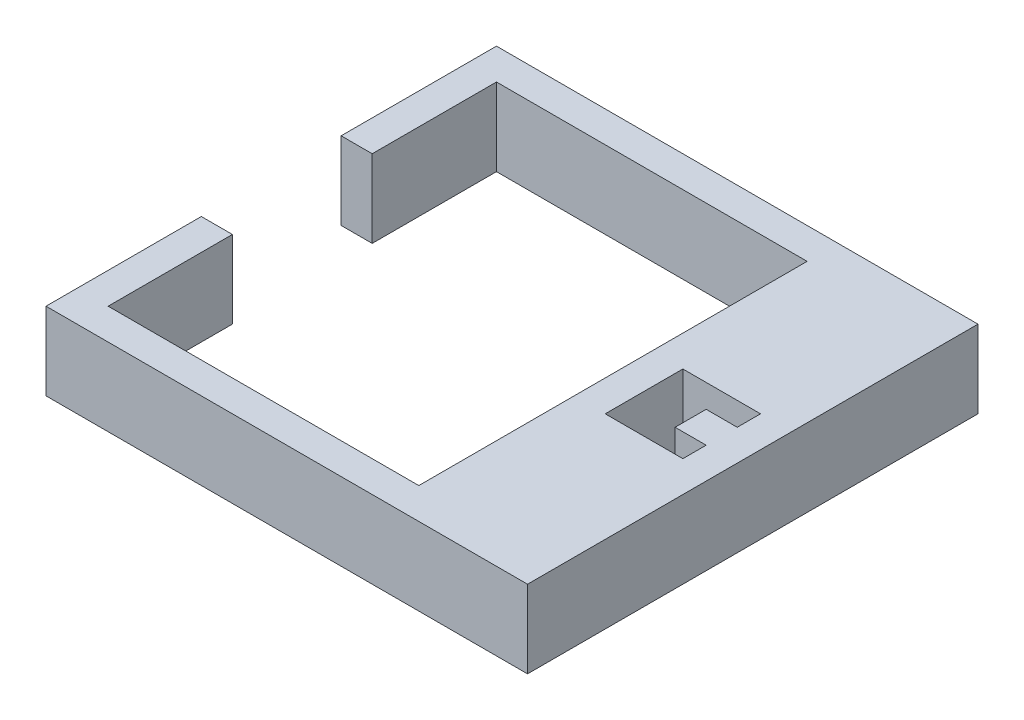
ISO-10303-21;
HEADER;
FILE_DESCRIPTION(('STEP AP214'),'2;1');
FILE_NAME('part.step','',(''),(''),'','','');
FILE_SCHEMA(('AUTOMOTIVE_DESIGN { 1 0 10303 214 1 1 1 1 }'));
ENDSEC;
DATA;
#1=APPLICATION_CONTEXT('core data for automotive mechanical design processes');
#2=APPLICATION_PROTOCOL_DEFINITION('international standard','automotive_design',2000,#1);
#3=PRODUCT_CONTEXT('',#1,'mechanical');
#4=PRODUCT('Part','Part','',(#3));
#5=PRODUCT_RELATED_PRODUCT_CATEGORY('part','',(#4));
#6=PRODUCT_DEFINITION_FORMATION('','',#4);
#7=PRODUCT_DEFINITION_CONTEXT('part definition',#1,'design');
#8=PRODUCT_DEFINITION('design','',#6,#7);
#9=PRODUCT_DEFINITION_SHAPE('','',#8);
#10=(LENGTH_UNIT() NAMED_UNIT(*) SI_UNIT(.MILLI.,.METRE.));
#11=(NAMED_UNIT(*) PLANE_ANGLE_UNIT() SI_UNIT($,.RADIAN.));
#12=(NAMED_UNIT(*) SI_UNIT($,.STERADIAN.) SOLID_ANGLE_UNIT());
#13=UNCERTAINTY_MEASURE_WITH_UNIT(LENGTH_MEASURE(1.E-05),#10,'distance_accuracy_value','');
#14=(GEOMETRIC_REPRESENTATION_CONTEXT(3) GLOBAL_UNCERTAINTY_ASSIGNED_CONTEXT((#13)) GLOBAL_UNIT_ASSIGNED_CONTEXT((#10,
#11,#12)) REPRESENTATION_CONTEXT('',''));
#15=CARTESIAN_POINT('',(0.,0.,0.));
#16=DIRECTION('',(0.,0.,1.));
#17=DIRECTION('',(1.,0.,0.));
#18=AXIS2_PLACEMENT_3D('',#15,#16,#17);
#19=CARTESIAN_POINT('',(6.06232294617563,50.,0.));
#20=DIRECTION('',(1.,0.,0.));
#21=DIRECTION('',(0.,0.,-1.));
#22=AXIS2_PLACEMENT_3D('',#19,#20,#21);
#23=PLANE('',#22);
#24=DIRECTION('',(0.,0.,1.));
#25=VECTOR('',#24,1.);
#26=CARTESIAN_POINT('',(6.06232294617563,0.,0.));
#27=LINE('',#26,#25);
#28=CARTESIAN_POINT('',(6.06232294617563,0.,-6.38810198300284));
#29=VERTEX_POINT('',#28);
#30=CARTESIAN_POINT('',(6.06232294617563,0.,13.6118980169972));
#31=VERTEX_POINT('',#30);
#32=EDGE_CURVE('E122',#29,#31,#27,.T.);
#33=ORIENTED_EDGE('',*,*,#32,.T.);
#34=DIRECTION('',(0.,-1.,0.));
#35=VECTOR('',#34,1.);
#36=CARTESIAN_POINT('',(6.06232294617563,50.,13.6118980169972));
#37=LINE('',#36,#35);
#38=CARTESIAN_POINT('',(6.06232294617563,50.,13.6118980169972));
#39=VERTEX_POINT('',#38);
#40=EDGE_CURVE('E89',#39,#31,#37,.T.);
#41=ORIENTED_EDGE('',*,*,#40,.F.);
#42=DIRECTION('',(0.,0.,1.));
#43=VECTOR('',#42,1.);
#44=CARTESIAN_POINT('',(6.06232294617563,50.,0.));
#45=LINE('',#44,#43);
#46=CARTESIAN_POINT('',(6.06232294617563,50.,-6.38810198300284));
#47=VERTEX_POINT('',#46);
#48=EDGE_CURVE('E113',#47,#39,#45,.T.);
#49=ORIENTED_EDGE('',*,*,#48,.F.);
#50=DIRECTION('',(0.,-1.,0.));
#51=VECTOR('',#50,1.);
#52=CARTESIAN_POINT('',(6.06232294617563,50.,-6.38810198300284));
#53=LINE('',#52,#51);
#54=EDGE_CURVE('E126',#47,#29,#53,.T.);
#55=ORIENTED_EDGE('',*,*,#54,.T.);
#56=EDGE_LOOP('',(#33,#41,#49,#55));
#57=FACE_BOUND('',#56,.T.);
#58=ADVANCED_FACE('F85',(#57),#23,.F.);
#59=CARTESIAN_POINT('',(0.,50.,-6.38810198300284));
#60=DIRECTION('',(0.,0.,1.));
#61=DIRECTION('',(1.,0.,0.));
#62=AXIS2_PLACEMENT_3D('',#59,#60,#61);
#63=PLANE('',#62);
#64=DIRECTION('',(-1.,0.,0.));
#65=VECTOR('',#64,1.);
#66=CARTESIAN_POINT('',(0.,0.,-6.38810198300284));
#67=LINE('',#66,#65);
#68=CARTESIAN_POINT('',(26.0623229461756,0.,-6.38810198300284));
#69=VERTEX_POINT('',#68);
#70=EDGE_CURVE('E131',#69,#29,#67,.T.);
#71=ORIENTED_EDGE('',*,*,#70,.T.);
#72=ORIENTED_EDGE('',*,*,#54,.F.);
#73=DIRECTION('',(-1.,0.,0.));
#74=VECTOR('',#73,1.);
#75=CARTESIAN_POINT('',(0.,50.,-6.38810198300284));
#76=LINE('',#75,#74);
#77=CARTESIAN_POINT('',(26.0623229461756,50.,-6.38810198300284));
#78=VERTEX_POINT('',#77);
#79=EDGE_CURVE('E283',#78,#47,#76,.T.);
#80=ORIENTED_EDGE('',*,*,#79,.F.);
#81=DIRECTION('',(0.,-1.,0.));
#82=VECTOR('',#81,1.);
#83=CARTESIAN_POINT('',(26.0623229461756,50.,-6.38810198300284));
#84=LINE('',#83,#82);
#85=EDGE_CURVE('E152',#78,#69,#84,.T.);
#86=ORIENTED_EDGE('',*,*,#85,.T.);
#87=EDGE_LOOP('',(#71,#72,#80,#86));
#88=FACE_BOUND('',#87,.T.);
#89=ADVANCED_FACE('F451',(#88),#63,.F.);
#90=CARTESIAN_POINT('',(0.,50.,-121.388101983003));
#91=DIRECTION('',(0.,0.,-1.));
#92=DIRECTION('',(-1.,0.,0.));
#93=AXIS2_PLACEMENT_3D('',#90,#91,#92);
#94=PLANE('',#93);
#95=DIRECTION('',(1.,0.,0.));
#96=VECTOR('',#95,1.);
#97=CARTESIAN_POINT('',(0.,0.,-121.388101983003));
#98=LINE('',#97,#96);
#99=CARTESIAN_POINT('',(-243.937677053824,0.,-121.388101983003));
#100=VERTEX_POINT('',#99);
#101=CARTESIAN_POINT('',(-43.9376770538244,0.,-121.388101983003));
#102=VERTEX_POINT('',#101);
#103=EDGE_CURVE('E225',#100,#102,#98,.T.);
#104=ORIENTED_EDGE('',*,*,#103,.T.);
#105=DIRECTION('',(0.,-1.,0.));
#106=VECTOR('',#105,1.);
#107=CARTESIAN_POINT('',(-43.9376770538244,50.,-121.388101983003));
#108=LINE('',#107,#106);
#109=CARTESIAN_POINT('',(-43.9376770538244,50.,-121.388101983003));
#110=VERTEX_POINT('',#109);
#111=EDGE_CURVE('E162',#110,#102,#108,.T.);
#112=ORIENTED_EDGE('',*,*,#111,.F.);
#113=DIRECTION('',(1.,0.,0.));
#114=VECTOR('',#113,1.);
#115=CARTESIAN_POINT('',(0.,50.,-121.388101983003));
#116=LINE('',#115,#114);
#117=CARTESIAN_POINT('',(-243.937677053824,50.,-121.388101983003));
#118=VERTEX_POINT('',#117);
#119=EDGE_CURVE('E273',#118,#110,#116,.T.);
#120=ORIENTED_EDGE('',*,*,#119,.F.);
#121=DIRECTION('',(0.,-1.,0.));
#122=VECTOR('',#121,1.);
#123=CARTESIAN_POINT('',(-243.937677053824,50.,-121.388101983003));
#124=LINE('',#123,#122);
#125=EDGE_CURVE('E95',#118,#100,#124,.T.);
#126=ORIENTED_EDGE('',*,*,#125,.T.);
#127=EDGE_LOOP('',(#104,#112,#120,#126));
#128=FACE_BOUND('',#127,.T.);
#129=ADVANCED_FACE('F405',(#128),#94,.F.);
#130=CARTESIAN_POINT('',(-43.9376770538244,50.,0.));
#131=DIRECTION('',(1.,0.,0.));
#132=DIRECTION('',(0.,0.,-1.));
#133=AXIS2_PLACEMENT_3D('',#130,#131,#132);
#134=PLANE('',#133);
#135=DIRECTION('',(0.,0.,1.));
#136=VECTOR('',#135,1.);
#137=CARTESIAN_POINT('',(-43.9376770538244,0.,0.));
#138=LINE('',#137,#136);
#139=CARTESIAN_POINT('',(-43.9376770538244,0.,128.611898016997));
#140=VERTEX_POINT('',#139);
#141=EDGE_CURVE('E222',#102,#140,#138,.T.);
#142=ORIENTED_EDGE('',*,*,#141,.T.);
#143=DIRECTION('',(0.,-1.,0.));
#144=VECTOR('',#143,1.);
#145=CARTESIAN_POINT('',(-43.9376770538244,50.,128.611898016997));
#146=LINE('',#145,#144);
#147=CARTESIAN_POINT('',(-43.9376770538244,50.,128.611898016997));
#148=VERTEX_POINT('',#147);
#149=EDGE_CURVE('E165',#148,#140,#146,.T.);
#150=ORIENTED_EDGE('',*,*,#149,.F.);
#151=DIRECTION('',(0.,0.,1.));
#152=VECTOR('',#151,1.);
#153=CARTESIAN_POINT('',(-43.9376770538244,50.,0.));
#154=LINE('',#153,#152);
#155=EDGE_CURVE('E270',#110,#148,#154,.T.);
#156=ORIENTED_EDGE('',*,*,#155,.F.);
#157=ORIENTED_EDGE('',*,*,#111,.T.);
#158=EDGE_LOOP('',(#142,#150,#156,#157));
#159=FACE_BOUND('',#158,.T.);
#160=ADVANCED_FACE('F440',(#159),#134,.F.);
#161=CARTESIAN_POINT('',(0.,50.,128.611898016997));
#162=DIRECTION('',(0.,0.,-1.));
#163=DIRECTION('',(-1.,0.,0.));
#164=AXIS2_PLACEMENT_3D('',#161,#162,#163);
#165=PLANE('',#164);
#166=DIRECTION('',(1.,0.,0.));
#167=VECTOR('',#166,1.);
#168=CARTESIAN_POINT('',(0.,0.,128.611898016997));
#169=LINE('',#168,#167);
#170=CARTESIAN_POINT('',(-243.937677053824,0.,128.611898016997));
#171=VERTEX_POINT('',#170);
#172=EDGE_CURVE('E219',#171,#140,#169,.T.);
#173=ORIENTED_EDGE('',*,*,#172,.F.);
#174=DIRECTION('',(0.,-1.,0.));
#175=VECTOR('',#174,1.);
#176=CARTESIAN_POINT('',(-243.937677053824,50.,128.611898016997));
#177=LINE('',#176,#175);
#178=CARTESIAN_POINT('',(-243.937677053824,50.,128.611898016997));
#179=VERTEX_POINT('',#178);
#180=EDGE_CURVE('E168',#179,#171,#177,.T.);
#181=ORIENTED_EDGE('',*,*,#180,.F.);
#182=DIRECTION('',(1.,0.,0.));
#183=VECTOR('',#182,1.);
#184=CARTESIAN_POINT('',(0.,50.,128.611898016997));
#185=LINE('',#184,#183);
#186=EDGE_CURVE('E267',#179,#148,#185,.T.);
#187=ORIENTED_EDGE('',*,*,#186,.T.);
#188=ORIENTED_EDGE('',*,*,#149,.T.);
#189=EDGE_LOOP('',(#173,#181,#187,#188));
#190=FACE_BOUND('',#189,.T.);
#191=ADVANCED_FACE('F435',(#190),#165,.T.);
#192=CARTESIAN_POINT('',(-243.937677053824,50.,0.));
#193=DIRECTION('',(-1.,0.,0.));
#194=DIRECTION('',(0.,0.,1.));
#195=AXIS2_PLACEMENT_3D('',#192,#193,#194);
#196=PLANE('',#195);
#197=DIRECTION('',(0.,0.,-1.));
#198=VECTOR('',#197,1.);
#199=CARTESIAN_POINT('',(-243.937677053824,0.,0.));
#200=LINE('',#199,#198);
#201=CARTESIAN_POINT('',(-243.937677053824,0.,48.6118980169971));
#202=VERTEX_POINT('',#201);
#203=EDGE_CURVE('E216',#171,#202,#200,.T.);
#204=ORIENTED_EDGE('',*,*,#203,.T.);
#205=DIRECTION('',(0.,-1.,0.));
#206=VECTOR('',#205,1.);
#207=CARTESIAN_POINT('',(-243.937677053824,50.,48.6118980169971));
#208=LINE('',#207,#206);
#209=CARTESIAN_POINT('',(-243.937677053824,50.,48.6118980169971));
#210=VERTEX_POINT('',#209);
#211=EDGE_CURVE('E171',#210,#202,#208,.T.);
#212=ORIENTED_EDGE('',*,*,#211,.F.);
#213=DIRECTION('',(0.,0.,-1.));
#214=VECTOR('',#213,1.);
#215=CARTESIAN_POINT('',(-243.937677053824,50.,0.));
#216=LINE('',#215,#214);
#217=EDGE_CURVE('E264',#179,#210,#216,.T.);
#218=ORIENTED_EDGE('',*,*,#217,.F.);
#219=ORIENTED_EDGE('',*,*,#180,.T.);
#220=EDGE_LOOP('',(#204,#212,#218,#219));
#221=FACE_BOUND('',#220,.T.);
#222=ADVANCED_FACE('F441',(#221),#196,.F.);
#223=CARTESIAN_POINT('',(0.,50.,48.6118980169971));
#224=DIRECTION('',(0.,0.,-1.));
#225=DIRECTION('',(-1.,0.,0.));
#226=AXIS2_PLACEMENT_3D('',#223,#224,#225);
#227=PLANE('',#226);
#228=DIRECTION('',(1.,0.,0.));
#229=VECTOR('',#228,1.);
#230=CARTESIAN_POINT('',(0.,0.,48.6118980169971));
#231=LINE('',#230,#229);
#232=CARTESIAN_POINT('',(-263.937677053824,0.,48.6118980169971));
#233=VERTEX_POINT('',#232);
#234=EDGE_CURVE('E213',#233,#202,#231,.T.);
#235=ORIENTED_EDGE('',*,*,#234,.F.);
#236=DIRECTION('',(0.,-1.,0.));
#237=VECTOR('',#236,1.);
#238=CARTESIAN_POINT('',(-263.937677053824,50.,48.6118980169971));
#239=LINE('',#238,#237);
#240=CARTESIAN_POINT('',(-263.937677053824,50.,48.6118980169971));
#241=VERTEX_POINT('',#240);
#242=EDGE_CURVE('E174',#241,#233,#239,.T.);
#243=ORIENTED_EDGE('',*,*,#242,.F.);
#244=DIRECTION('',(1.,0.,0.));
#245=VECTOR('',#244,1.);
#246=CARTESIAN_POINT('',(0.,50.,48.6118980169971));
#247=LINE('',#246,#245);
#248=EDGE_CURVE('E261',#241,#210,#247,.T.);
#249=ORIENTED_EDGE('',*,*,#248,.T.);
#250=ORIENTED_EDGE('',*,*,#211,.T.);
#251=EDGE_LOOP('',(#235,#243,#249,#250));
#252=FACE_BOUND('',#251,.T.);
#253=ADVANCED_FACE('F429',(#252),#227,.T.);
#254=CARTESIAN_POINT('',(-263.937677053824,50.,0.));
#255=DIRECTION('',(-1.,0.,0.));
#256=DIRECTION('',(0.,0.,1.));
#257=AXIS2_PLACEMENT_3D('',#254,#255,#256);
#258=PLANE('',#257);
#259=DIRECTION('',(0.,0.,-1.));
#260=VECTOR('',#259,1.);
#261=CARTESIAN_POINT('',(-263.937677053824,0.,0.));
#262=LINE('',#261,#260);
#263=CARTESIAN_POINT('',(-263.937677053824,0.,148.611898016997));
#264=VERTEX_POINT('',#263);
#265=EDGE_CURVE('E210',#264,#233,#262,.T.);
#266=ORIENTED_EDGE('',*,*,#265,.F.);
#267=DIRECTION('',(0.,-1.,0.));
#268=VECTOR('',#267,1.);
#269=CARTESIAN_POINT('',(-263.937677053824,50.,148.611898016997));
#270=LINE('',#269,#268);
#271=CARTESIAN_POINT('',(-263.937677053824,50.,148.611898016997));
#272=VERTEX_POINT('',#271);
#273=EDGE_CURVE('E177',#272,#264,#270,.T.);
#274=ORIENTED_EDGE('',*,*,#273,.F.);
#275=DIRECTION('',(0.,0.,-1.));
#276=VECTOR('',#275,1.);
#277=CARTESIAN_POINT('',(-263.937677053824,50.,0.));
#278=LINE('',#277,#276);
#279=EDGE_CURVE('E258',#272,#241,#278,.T.);
#280=ORIENTED_EDGE('',*,*,#279,.T.);
#281=ORIENTED_EDGE('',*,*,#242,.T.);
#282=EDGE_LOOP('',(#266,#274,#280,#281));
#283=FACE_BOUND('',#282,.T.);
#284=ADVANCED_FACE('F423',(#283),#258,.T.);
#285=CARTESIAN_POINT('',(0.,50.,148.611898016997));
#286=DIRECTION('',(0.,0.,-1.));
#287=DIRECTION('',(-1.,0.,0.));
#288=AXIS2_PLACEMENT_3D('',#285,#286,#287);
#289=PLANE('',#288);
#290=DIRECTION('',(1.,0.,0.));
#291=VECTOR('',#290,1.);
#292=CARTESIAN_POINT('',(0.,0.,148.611898016997));
#293=LINE('',#292,#291);
#294=CARTESIAN_POINT('',(46.0623229461755,0.,148.611898016997));
#295=VERTEX_POINT('',#294);
#296=EDGE_CURVE('E207',#264,#295,#293,.T.);
#297=ORIENTED_EDGE('',*,*,#296,.T.);
#298=DIRECTION('',(0.,-1.,0.));
#299=VECTOR('',#298,1.);
#300=CARTESIAN_POINT('',(46.0623229461755,50.,148.611898016997));
#301=LINE('',#300,#299);
#302=CARTESIAN_POINT('',(46.0623229461755,50.,148.611898016997));
#303=VERTEX_POINT('',#302);
#304=EDGE_CURVE('E180',#303,#295,#301,.T.);
#305=ORIENTED_EDGE('',*,*,#304,.F.);
#306=DIRECTION('',(1.,0.,0.));
#307=VECTOR('',#306,1.);
#308=CARTESIAN_POINT('',(0.,50.,148.611898016997));
#309=LINE('',#308,#307);
#310=EDGE_CURVE('E255',#272,#303,#309,.T.);
#311=ORIENTED_EDGE('',*,*,#310,.F.);
#312=ORIENTED_EDGE('',*,*,#273,.T.);
#313=EDGE_LOOP('',(#297,#305,#311,#312));
#314=FACE_BOUND('',#313,.T.);
#315=ADVANCED_FACE('F596',(#314),#289,.F.);
#316=CARTESIAN_POINT('',(46.0623229461756,50.,0.));
#317=DIRECTION('',(1.,0.,0.));
#318=DIRECTION('',(0.,0.,-1.));
#319=AXIS2_PLACEMENT_3D('',#316,#317,#318);
#320=PLANE('',#319);
#321=DIRECTION('',(0.,0.,1.));
#322=VECTOR('',#321,1.);
#323=CARTESIAN_POINT('',(46.0623229461756,0.,0.));
#324=LINE('',#323,#322);
#325=CARTESIAN_POINT('',(46.0623229461756,0.,-141.388101983003));
#326=VERTEX_POINT('',#325);
#327=EDGE_CURVE('E204',#326,#295,#324,.T.);
#328=ORIENTED_EDGE('',*,*,#327,.F.);
#329=DIRECTION('',(0.,-1.,0.));
#330=VECTOR('',#329,1.);
#331=CARTESIAN_POINT('',(46.0623229461756,50.,-141.388101983003));
#332=LINE('',#331,#330);
#333=CARTESIAN_POINT('',(46.0623229461756,50.,-141.388101983003));
#334=VERTEX_POINT('',#333);
#335=EDGE_CURVE('E183',#334,#326,#332,.T.);
#336=ORIENTED_EDGE('',*,*,#335,.F.);
#337=DIRECTION('',(0.,0.,1.));
#338=VECTOR('',#337,1.);
#339=CARTESIAN_POINT('',(46.0623229461756,50.,0.));
#340=LINE('',#339,#338);
#341=EDGE_CURVE('E252',#334,#303,#340,.T.);
#342=ORIENTED_EDGE('',*,*,#341,.T.);
#343=ORIENTED_EDGE('',*,*,#304,.T.);
#344=EDGE_LOOP('',(#328,#336,#342,#343));
#345=FACE_BOUND('',#344,.T.);
#346=ADVANCED_FACE('F417',(#345),#320,.T.);
#347=CARTESIAN_POINT('',(0.,50.,-141.388101983003));
#348=DIRECTION('',(0.,0.,-1.));
#349=DIRECTION('',(-1.,0.,0.));
#350=AXIS2_PLACEMENT_3D('',#347,#348,#349);
#351=PLANE('',#350);
#352=DIRECTION('',(1.,0.,0.));
#353=VECTOR('',#352,1.);
#354=CARTESIAN_POINT('',(0.,0.,-141.388101983003));
#355=LINE('',#354,#353);
#356=CARTESIAN_POINT('',(-263.937677053824,0.,-141.388101983003));
#357=VERTEX_POINT('',#356);
#358=EDGE_CURVE('E201',#357,#326,#355,.T.);
#359=ORIENTED_EDGE('',*,*,#358,.F.);
#360=DIRECTION('',(0.,-1.,0.));
#361=VECTOR('',#360,1.);
#362=CARTESIAN_POINT('',(-263.937677053824,50.,-141.388101983003));
#363=LINE('',#362,#361);
#364=CARTESIAN_POINT('',(-263.937677053824,50.,-141.388101983003));
#365=VERTEX_POINT('',#364);
#366=EDGE_CURVE('E186',#365,#357,#363,.T.);
#367=ORIENTED_EDGE('',*,*,#366,.F.);
#368=DIRECTION('',(1.,0.,0.));
#369=VECTOR('',#368,1.);
#370=CARTESIAN_POINT('',(0.,50.,-141.388101983003));
#371=LINE('',#370,#369);
#372=EDGE_CURVE('E249',#365,#334,#371,.T.);
#373=ORIENTED_EDGE('',*,*,#372,.T.);
#374=ORIENTED_EDGE('',*,*,#335,.T.);
#375=EDGE_LOOP('',(#359,#367,#373,#374));
#376=FACE_BOUND('',#375,.T.);
#377=ADVANCED_FACE('F414',(#376),#351,.T.);
#378=CARTESIAN_POINT('',(-263.937677053824,50.,0.));
#379=DIRECTION('',(1.,0.,0.));
#380=DIRECTION('',(0.,0.,-1.));
#381=AXIS2_PLACEMENT_3D('',#378,#379,#380);
#382=PLANE('',#381);
#383=DIRECTION('',(0.,0.,1.));
#384=VECTOR('',#383,1.);
#385=CARTESIAN_POINT('',(-263.937677053824,0.,0.));
#386=LINE('',#385,#384);
#387=CARTESIAN_POINT('',(-263.937677053824,0.,-41.3881019830028));
#388=VERTEX_POINT('',#387);
#389=EDGE_CURVE('E198',#357,#388,#386,.T.);
#390=ORIENTED_EDGE('',*,*,#389,.T.);
#391=DIRECTION('',(0.,-1.,0.));
#392=VECTOR('',#391,1.);
#393=CARTESIAN_POINT('',(-263.937677053824,50.,-41.3881019830028));
#394=LINE('',#393,#392);
#395=CARTESIAN_POINT('',(-263.937677053824,50.,-41.3881019830028));
#396=VERTEX_POINT('',#395);
#397=EDGE_CURVE('E189',#396,#388,#394,.T.);
#398=ORIENTED_EDGE('',*,*,#397,.F.);
#399=DIRECTION('',(0.,0.,1.));
#400=VECTOR('',#399,1.);
#401=CARTESIAN_POINT('',(-263.937677053824,50.,0.));
#402=LINE('',#401,#400);
#403=EDGE_CURVE('E246',#365,#396,#402,.T.);
#404=ORIENTED_EDGE('',*,*,#403,.F.);
#405=ORIENTED_EDGE('',*,*,#366,.T.);
#406=EDGE_LOOP('',(#390,#398,#404,#405));
#407=FACE_BOUND('',#406,.T.);
#408=ADVANCED_FACE('F411',(#407),#382,.F.);
#409=CARTESIAN_POINT('',(0.,50.,-41.3881019830028));
#410=DIRECTION('',(0.,0.,-1.));
#411=DIRECTION('',(-1.,0.,0.));
#412=AXIS2_PLACEMENT_3D('',#409,#410,#411);
#413=PLANE('',#412);
#414=DIRECTION('',(1.,0.,0.));
#415=VECTOR('',#414,1.);
#416=CARTESIAN_POINT('',(0.,0.,-41.3881019830028));
#417=LINE('',#416,#415);
#418=CARTESIAN_POINT('',(-243.937677053824,0.,-41.3881019830028));
#419=VERTEX_POINT('',#418);
#420=EDGE_CURVE('E194',#388,#419,#417,.T.);
#421=ORIENTED_EDGE('',*,*,#420,.T.);
#422=DIRECTION('',(0.,-1.,0.));
#423=VECTOR('',#422,1.);
#424=CARTESIAN_POINT('',(-243.937677053824,50.,-41.3881019830028));
#425=LINE('',#424,#423);
#426=CARTESIAN_POINT('',(-243.937677053824,50.,-41.3881019830028));
#427=VERTEX_POINT('',#426);
#428=EDGE_CURVE('E145',#427,#419,#425,.T.);
#429=ORIENTED_EDGE('',*,*,#428,.F.);
#430=DIRECTION('',(1.,0.,0.));
#431=VECTOR('',#430,1.);
#432=CARTESIAN_POINT('',(0.,50.,-41.3881019830028));
#433=LINE('',#432,#431);
#434=EDGE_CURVE('E159',#396,#427,#433,.T.);
#435=ORIENTED_EDGE('',*,*,#434,.F.);
#436=ORIENTED_EDGE('',*,*,#397,.T.);
#437=EDGE_LOOP('',(#421,#429,#435,#436));
#438=FACE_BOUND('',#437,.T.);
#439=ADVANCED_FACE('F399',(#438),#413,.F.);
#440=CARTESIAN_POINT('',(-243.937677053824,50.,0.));
#441=DIRECTION('',(1.,0.,0.));
#442=DIRECTION('',(0.,0.,-1.));
#443=AXIS2_PLACEMENT_3D('',#440,#441,#442);
#444=PLANE('',#443);
#445=DIRECTION('',(0.,0.,1.));
#446=VECTOR('',#445,1.);
#447=CARTESIAN_POINT('',(-243.937677053824,0.,0.));
#448=LINE('',#447,#446);
#449=EDGE_CURVE('E228',#100,#419,#448,.T.);
#450=ORIENTED_EDGE('',*,*,#449,.F.);
#451=ORIENTED_EDGE('',*,*,#125,.F.);
#452=DIRECTION('',(0.,0.,1.));
#453=VECTOR('',#452,1.);
#454=CARTESIAN_POINT('',(-243.937677053824,50.,0.));
#455=LINE('',#454,#453);
#456=EDGE_CURVE('E276',#118,#427,#455,.T.);
#457=ORIENTED_EDGE('',*,*,#456,.T.);
#458=ORIENTED_EDGE('',*,*,#428,.T.);
#459=EDGE_LOOP('',(#450,#451,#457,#458));
#460=FACE_BOUND('',#459,.T.);
#461=ADVANCED_FACE('F396',(#460),#444,.T.);
#462=CARTESIAN_POINT('',(26.0623229461756,50.,0.));
#463=DIRECTION('',(1.,0.,0.));
#464=DIRECTION('',(0.,0.,-1.));
#465=AXIS2_PLACEMENT_3D('',#462,#463,#464);
#466=PLANE('',#465);
#467=DIRECTION('',(0.,0.,1.));
#468=VECTOR('',#467,1.);
#469=CARTESIAN_POINT('',(26.0623229461756,50.,0.));
#470=LINE('',#469,#468);
#471=CARTESIAN_POINT('',(26.0623229461756,50.,13.6118980169972));
#472=VERTEX_POINT('',#471);
#473=CARTESIAN_POINT('',(26.0623229461756,50.,28.6118980169972));
#474=VERTEX_POINT('',#473);
#475=EDGE_CURVE('E279',#472,#474,#470,.T.);
#476=ORIENTED_EDGE('',*,*,#475,.F.);
#477=DIRECTION('',(0.,-1.,0.));
#478=VECTOR('',#477,1.);
#479=CARTESIAN_POINT('',(26.0623229461756,50.,13.6118980169972));
#480=LINE('',#479,#478);
#481=CARTESIAN_POINT('',(26.0623229461756,0.,13.6118980169972));
#482=VERTEX_POINT('',#481);
#483=EDGE_CURVE('E12',#472,#482,#480,.T.);
#484=ORIENTED_EDGE('',*,*,#483,.T.);
#485=DIRECTION('',(0.,0.,1.));
#486=VECTOR('',#485,1.);
#487=CARTESIAN_POINT('',(26.0623229461756,0.,0.));
#488=LINE('',#487,#486);
#489=CARTESIAN_POINT('',(26.0623229461756,0.,28.6118980169972));
#490=VERTEX_POINT('',#489);
#491=EDGE_CURVE('E130',#482,#490,#488,.T.);
#492=ORIENTED_EDGE('',*,*,#491,.T.);
#493=DIRECTION('',(0.,-1.,0.));
#494=VECTOR('',#493,1.);
#495=CARTESIAN_POINT('',(26.0623229461756,50.,28.6118980169972));
#496=LINE('',#495,#494);
#497=EDGE_CURVE('E156',#474,#490,#496,.T.);
#498=ORIENTED_EDGE('',*,*,#497,.F.);
#499=EDGE_LOOP('',(#476,#484,#492,#498));
#500=FACE_BOUND('',#499,.T.);
#501=ADVANCED_FACE('F463',(#500),#466,.F.);
#502=CARTESIAN_POINT('',(0.,50.,28.6118980169972));
#503=DIRECTION('',(0.,0.,-1.));
#504=DIRECTION('',(-1.,0.,0.));
#505=AXIS2_PLACEMENT_3D('',#502,#503,#504);
#506=PLANE('',#505);
#507=DIRECTION('',(1.,0.,0.));
#508=VECTOR('',#507,1.);
#509=CARTESIAN_POINT('',(0.,0.,28.6118980169972));
#510=LINE('',#509,#508);
#511=CARTESIAN_POINT('',(-23.9376770538244,0.,28.6118980169972));
#512=VERTEX_POINT('',#511);
#513=EDGE_CURVE('E136',#512,#490,#510,.T.);
#514=ORIENTED_EDGE('',*,*,#513,.F.);
#515=DIRECTION('',(0.,-1.,0.));
#516=VECTOR('',#515,1.);
#517=CARTESIAN_POINT('',(-23.9376770538244,50.,28.6118980169972));
#518=LINE('',#517,#516);
#519=CARTESIAN_POINT('',(-23.9376770538244,50.,28.6118980169972));
#520=VERTEX_POINT('',#519);
#521=EDGE_CURVE('E143',#520,#512,#518,.T.);
#522=ORIENTED_EDGE('',*,*,#521,.F.);
#523=DIRECTION('',(1.,0.,0.));
#524=VECTOR('',#523,1.);
#525=CARTESIAN_POINT('',(0.,50.,28.6118980169972));
#526=LINE('',#525,#524);
#527=EDGE_CURVE('E197',#520,#474,#526,.T.);
#528=ORIENTED_EDGE('',*,*,#527,.T.);
#529=ORIENTED_EDGE('',*,*,#497,.T.);
#530=EDGE_LOOP('',(#514,#522,#528,#529));
#531=FACE_BOUND('',#530,.T.);
#532=ADVANCED_FACE('F300',(#531),#506,.T.);
#533=CARTESIAN_POINT('',(-23.9376770538244,50.,0.));
#534=DIRECTION('',(1.,0.,0.));
#535=DIRECTION('',(0.,0.,-1.));
#536=AXIS2_PLACEMENT_3D('',#533,#534,#535);
#537=PLANE('',#536);
#538=DIRECTION('',(0.,0.,1.));
#539=VECTOR('',#538,1.);
#540=CARTESIAN_POINT('',(-23.9376770538244,0.,0.));
#541=LINE('',#540,#539);
#542=CARTESIAN_POINT('',(-23.9376770538244,0.,-21.3881019830028));
#543=VERTEX_POINT('',#542);
#544=EDGE_CURVE('E240',#543,#512,#541,.T.);
#545=ORIENTED_EDGE('',*,*,#544,.F.);
#546=DIRECTION('',(0.,-1.,0.));
#547=VECTOR('',#546,1.);
#548=CARTESIAN_POINT('',(-23.9376770538244,50.,-21.3881019830028));
#549=LINE('',#548,#547);
#550=CARTESIAN_POINT('',(-23.9376770538244,50.,-21.3881019830028));
#551=VERTEX_POINT('',#550);
#552=EDGE_CURVE('E146',#551,#543,#549,.T.);
#553=ORIENTED_EDGE('',*,*,#552,.F.);
#554=DIRECTION('',(0.,0.,1.));
#555=VECTOR('',#554,1.);
#556=CARTESIAN_POINT('',(-23.9376770538244,50.,0.));
#557=LINE('',#556,#555);
#558=EDGE_CURVE('E291',#551,#520,#557,.T.);
#559=ORIENTED_EDGE('',*,*,#558,.T.);
#560=ORIENTED_EDGE('',*,*,#521,.T.);
#561=EDGE_LOOP('',(#545,#553,#559,#560));
#562=FACE_BOUND('',#561,.T.);
#563=ADVANCED_FACE('F317',(#562),#537,.T.);
#564=CARTESIAN_POINT('',(0.,50.,-21.3881019830028));
#565=DIRECTION('',(0.,0.,-1.));
#566=DIRECTION('',(-1.,0.,0.));
#567=AXIS2_PLACEMENT_3D('',#564,#565,#566);
#568=PLANE('',#567);
#569=DIRECTION('',(1.,0.,0.));
#570=VECTOR('',#569,1.);
#571=CARTESIAN_POINT('',(0.,0.,-21.3881019830028));
#572=LINE('',#571,#570);
#573=CARTESIAN_POINT('',(26.0623229461756,0.,-21.3881019830028));
#574=VERTEX_POINT('',#573);
#575=EDGE_CURVE('E237',#543,#574,#572,.T.);
#576=ORIENTED_EDGE('',*,*,#575,.T.);
#577=DIRECTION('',(0.,-1.,0.));
#578=VECTOR('',#577,1.);
#579=CARTESIAN_POINT('',(26.0623229461756,50.,-21.3881019830028));
#580=LINE('',#579,#578);
#581=CARTESIAN_POINT('',(26.0623229461756,50.,-21.3881019830028));
#582=VERTEX_POINT('',#581);
#583=EDGE_CURVE('E149',#582,#574,#580,.T.);
#584=ORIENTED_EDGE('',*,*,#583,.F.);
#585=DIRECTION('',(1.,0.,0.));
#586=VECTOR('',#585,1.);
#587=CARTESIAN_POINT('',(0.,50.,-21.3881019830028));
#588=LINE('',#587,#586);
#589=EDGE_CURVE('E288',#551,#582,#588,.T.);
#590=ORIENTED_EDGE('',*,*,#589,.F.);
#591=ORIENTED_EDGE('',*,*,#552,.T.);
#592=EDGE_LOOP('',(#576,#584,#590,#591));
#593=FACE_BOUND('',#592,.T.);
#594=ADVANCED_FACE('F324',(#593),#568,.F.);
#595=CARTESIAN_POINT('',(26.0623229461756,50.,0.));
#596=DIRECTION('',(1.,0.,0.));
#597=DIRECTION('',(0.,0.,-1.));
#598=AXIS2_PLACEMENT_3D('',#595,#596,#597);
#599=PLANE('',#598);
#600=DIRECTION('',(0.,0.,1.));
#601=VECTOR('',#600,1.);
#602=CARTESIAN_POINT('',(26.0623229461756,0.,0.));
#603=LINE('',#602,#601);
#604=EDGE_CURVE('E234',#574,#69,#603,.T.);
#605=ORIENTED_EDGE('',*,*,#604,.T.);
#606=ORIENTED_EDGE('',*,*,#85,.F.);
#607=DIRECTION('',(0.,0.,1.));
#608=VECTOR('',#607,1.);
#609=CARTESIAN_POINT('',(26.0623229461756,50.,0.));
#610=LINE('',#609,#608);
#611=EDGE_CURVE('E285',#582,#78,#610,.T.);
#612=ORIENTED_EDGE('',*,*,#611,.F.);
#613=ORIENTED_EDGE('',*,*,#583,.T.);
#614=EDGE_LOOP('',(#605,#606,#612,#613));
#615=FACE_BOUND('',#614,.T.);
#616=ADVANCED_FACE('F469',(#615),#599,.F.);
#617=CARTESIAN_POINT('',(0.,0.,0.));
#618=DIRECTION('',(0.,1.,0.));
#619=DIRECTION('',(0.,0.,1.));
#620=AXIS2_PLACEMENT_3D('',#617,#618,#619);
#621=PLANE('',#620);
#622=ORIENTED_EDGE('',*,*,#491,.F.);
#623=DIRECTION('',(-1.,0.,0.));
#624=VECTOR('',#623,1.);
#625=CARTESIAN_POINT('',(26.0623229461756,0.,13.6118980169972));
#626=LINE('',#625,#624);
#627=EDGE_CURVE('E133',#482,#31,#626,.T.);
#628=ORIENTED_EDGE('',*,*,#627,.T.);
#629=ORIENTED_EDGE('',*,*,#32,.F.);
#630=ORIENTED_EDGE('',*,*,#70,.F.);
#631=ORIENTED_EDGE('',*,*,#604,.F.);
#632=ORIENTED_EDGE('',*,*,#575,.F.);
#633=ORIENTED_EDGE('',*,*,#544,.T.);
#634=ORIENTED_EDGE('',*,*,#513,.T.);
#635=EDGE_LOOP('',(#622,#628,#629,#630,#631,#632,#633,#634));
#636=FACE_BOUND('',#635,.T.);
#637=ORIENTED_EDGE('',*,*,#449,.T.);
#638=ORIENTED_EDGE('',*,*,#420,.F.);
#639=ORIENTED_EDGE('',*,*,#389,.F.);
#640=ORIENTED_EDGE('',*,*,#358,.T.);
#641=ORIENTED_EDGE('',*,*,#327,.T.);
#642=ORIENTED_EDGE('',*,*,#296,.F.);
#643=ORIENTED_EDGE('',*,*,#265,.T.);
#644=ORIENTED_EDGE('',*,*,#234,.T.);
#645=ORIENTED_EDGE('',*,*,#203,.F.);
#646=ORIENTED_EDGE('',*,*,#172,.T.);
#647=ORIENTED_EDGE('',*,*,#141,.F.);
#648=ORIENTED_EDGE('',*,*,#103,.F.);
#649=EDGE_LOOP('',(#637,#638,#639,#640,#641,#642,#643,#644,#645,#646,#647,#648));
#650=FACE_BOUND('',#649,.T.);
#651=ADVANCED_FACE('F137',(#636,#650),#621,.F.);
#652=CARTESIAN_POINT('',(0.,50.,0.));
#653=DIRECTION('',(0.,1.,0.));
#654=DIRECTION('',(0.,0.,1.));
#655=AXIS2_PLACEMENT_3D('',#652,#653,#654);
#656=PLANE('',#655);
#657=ORIENTED_EDGE('',*,*,#611,.T.);
#658=ORIENTED_EDGE('',*,*,#79,.T.);
#659=ORIENTED_EDGE('',*,*,#48,.T.);
#660=DIRECTION('',(-1.,0.,0.));
#661=VECTOR('',#660,1.);
#662=CARTESIAN_POINT('',(26.0623229461756,50.,13.6118980169972));
#663=LINE('',#662,#661);
#664=EDGE_CURVE('E135',#472,#39,#663,.T.);
#665=ORIENTED_EDGE('',*,*,#664,.F.);
#666=ORIENTED_EDGE('',*,*,#475,.T.);
#667=ORIENTED_EDGE('',*,*,#527,.F.);
#668=ORIENTED_EDGE('',*,*,#558,.F.);
#669=ORIENTED_EDGE('',*,*,#589,.T.);
#670=EDGE_LOOP('',(#657,#658,#659,#665,#666,#667,#668,#669));
#671=FACE_BOUND('',#670,.T.);
#672=ORIENTED_EDGE('',*,*,#456,.F.);
#673=ORIENTED_EDGE('',*,*,#119,.T.);
#674=ORIENTED_EDGE('',*,*,#155,.T.);
#675=ORIENTED_EDGE('',*,*,#186,.F.);
#676=ORIENTED_EDGE('',*,*,#217,.T.);
#677=ORIENTED_EDGE('',*,*,#248,.F.);
#678=ORIENTED_EDGE('',*,*,#279,.F.);
#679=ORIENTED_EDGE('',*,*,#310,.T.);
#680=ORIENTED_EDGE('',*,*,#341,.F.);
#681=ORIENTED_EDGE('',*,*,#372,.F.);
#682=ORIENTED_EDGE('',*,*,#403,.T.);
#683=ORIENTED_EDGE('',*,*,#434,.T.);
#684=EDGE_LOOP('',(#672,#673,#674,#675,#676,#677,#678,#679,#680,#681,#682,#683));
#685=FACE_BOUND('',#684,.T.);
#686=ADVANCED_FACE('F308',(#671,#685),#656,.T.);
#687=CARTESIAN_POINT('',(26.0623229461756,50.,13.6118980169972));
#688=DIRECTION('',(0.,0.,1.));
#689=DIRECTION('',(1.,0.,0.));
#690=AXIS2_PLACEMENT_3D('',#687,#688,#689);
#691=PLANE('',#690);
#692=ORIENTED_EDGE('',*,*,#627,.F.);
#693=ORIENTED_EDGE('',*,*,#483,.F.);
#694=ORIENTED_EDGE('',*,*,#664,.T.);
#695=ORIENTED_EDGE('',*,*,#40,.T.);
#696=EDGE_LOOP('',(#692,#693,#694,#695));
#697=FACE_BOUND('',#696,.T.);
#698=ADVANCED_FACE('F87',(#697),#691,.T.);
#699=CLOSED_SHELL('',(#58,#89,#129,#160,#191,#222,#253,#284,#315,#346,#377,#408,#439,#461,#501,
#532,#563,#594,#616,#651,#686,#698));
#700=MANIFOLD_SOLID_BREP('B2',#699);
#701=ADVANCED_BREP_SHAPE_REPRESENTATION('',(#18,#700),#14);
#702=SHAPE_DEFINITION_REPRESENTATION(#9,#701);
ENDSEC;
END-ISO-10303-21;
